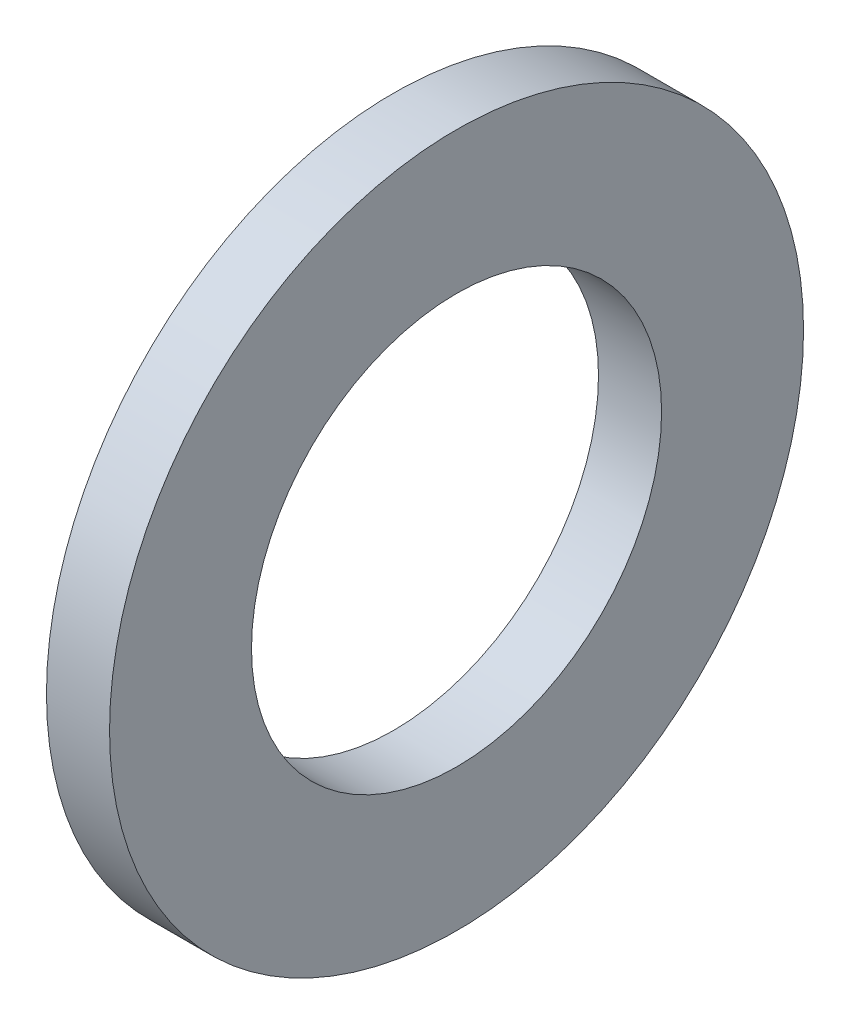
ISO-10303-21;
HEADER;
FILE_DESCRIPTION(('STEP AP214'),'2;1');
FILE_NAME('part.step','',(''),(''),'','','');
FILE_SCHEMA(('AUTOMOTIVE_DESIGN { 1 0 10303 214 1 1 1 1 }'));
ENDSEC;
DATA;
#1=APPLICATION_CONTEXT('core data for automotive mechanical design processes');
#2=APPLICATION_PROTOCOL_DEFINITION('international standard','automotive_design',2000,#1);
#3=PRODUCT_CONTEXT('',#1,'mechanical');
#4=PRODUCT('Part','Part','',(#3));
#5=PRODUCT_RELATED_PRODUCT_CATEGORY('part','',(#4));
#6=PRODUCT_DEFINITION_FORMATION('','',#4);
#7=PRODUCT_DEFINITION_CONTEXT('part definition',#1,'design');
#8=PRODUCT_DEFINITION('design','',#6,#7);
#9=PRODUCT_DEFINITION_SHAPE('','',#8);
#10=(LENGTH_UNIT() NAMED_UNIT(*) SI_UNIT(.MILLI.,.METRE.));
#11=(NAMED_UNIT(*) PLANE_ANGLE_UNIT() SI_UNIT($,.RADIAN.));
#12=(NAMED_UNIT(*) SI_UNIT($,.STERADIAN.) SOLID_ANGLE_UNIT());
#13=UNCERTAINTY_MEASURE_WITH_UNIT(LENGTH_MEASURE(1.E-05),#10,'distance_accuracy_value','');
#14=(GEOMETRIC_REPRESENTATION_CONTEXT(3) GLOBAL_UNCERTAINTY_ASSIGNED_CONTEXT((#13)) GLOBAL_UNIT_ASSIGNED_CONTEXT((#10,
#11,#12)) REPRESENTATION_CONTEXT('',''));
#15=CARTESIAN_POINT('',(0.,0.,0.));
#16=DIRECTION('',(0.,0.,1.));
#17=DIRECTION('',(1.,0.,0.));
#18=AXIS2_PLACEMENT_3D('',#15,#16,#17);
#19=CARTESIAN_POINT('',(-4.,22.,0.));
#20=DIRECTION('',(1.,0.,0.));
#21=DIRECTION('',(0.,0.,-1.));
#22=AXIS2_PLACEMENT_3D('',#19,#20,#21);
#23=PLANE('',#22);
#24=CARTESIAN_POINT('',(-4.,0.,0.));
#25=DIRECTION('',(-1.,0.,0.));
#26=DIRECTION('',(0.,0.,1.));
#27=AXIS2_PLACEMENT_3D('',#24,#25,#26);
#28=CIRCLE('',#27,22.);
#29=CARTESIAN_POINT('',(-4.,0.,22.));
#30=VERTEX_POINT('',#29);
#31=EDGE_CURVE('E18',#30,#30,#28,.F.);
#32=ORIENTED_EDGE('',*,*,#31,.F.);
#33=EDGE_LOOP('',(#32));
#34=FACE_BOUND('',#33,.T.);
#35=CARTESIAN_POINT('',(-4.,0.,0.));
#36=DIRECTION('',(-1.,0.,0.));
#37=DIRECTION('',(0.,0.,1.));
#38=AXIS2_PLACEMENT_3D('',#35,#36,#37);
#39=CIRCLE('',#38,13.);
#40=CARTESIAN_POINT('',(-4.,0.,13.));
#41=VERTEX_POINT('',#40);
#42=EDGE_CURVE('E27',#41,#41,#39,.F.);
#43=ORIENTED_EDGE('',*,*,#42,.T.);
#44=EDGE_LOOP('',(#43));
#45=FACE_BOUND('',#44,.T.);
#46=ADVANCED_FACE('F15',(#34,#45),#23,.F.);
#47=CARTESIAN_POINT('',(-34.9249999999999,0.,0.));
#48=DIRECTION('',(-1.,0.,0.));
#49=DIRECTION('',(0.,0.,1.));
#50=AXIS2_PLACEMENT_3D('',#47,#48,#49);
#51=CYLINDRICAL_SURFACE('',#50,22.);
#52=ORIENTED_EDGE('',*,*,#31,.T.);
#53=EDGE_LOOP('',(#52));
#54=FACE_BOUND('',#53,.T.);
#55=CARTESIAN_POINT('',(0.,0.,0.));
#56=DIRECTION('',(-1.,0.,0.));
#57=DIRECTION('',(0.,0.,1.));
#58=AXIS2_PLACEMENT_3D('',#55,#56,#57);
#59=CIRCLE('',#58,22.);
#60=CARTESIAN_POINT('',(0.,0.,22.));
#61=VERTEX_POINT('',#60);
#62=EDGE_CURVE('E22',#61,#61,#59,.T.);
#63=ORIENTED_EDGE('',*,*,#62,.T.);
#64=EDGE_LOOP('',(#63));
#65=FACE_BOUND('',#64,.T.);
#66=ADVANCED_FACE('F35',(#54,#65),#51,.T.);
#67=CARTESIAN_POINT('',(-34.9249999999999,0.,0.));
#68=DIRECTION('',(-1.,0.,0.));
#69=DIRECTION('',(0.,0.,1.));
#70=AXIS2_PLACEMENT_3D('',#67,#68,#69);
#71=CYLINDRICAL_SURFACE('',#70,13.);
#72=CARTESIAN_POINT('',(0.,0.,0.));
#73=DIRECTION('',(-1.,0.,0.));
#74=DIRECTION('',(0.,0.,1.));
#75=AXIS2_PLACEMENT_3D('',#72,#73,#74);
#76=CIRCLE('',#75,13.);
#77=CARTESIAN_POINT('',(0.,0.,13.));
#78=VERTEX_POINT('',#77);
#79=EDGE_CURVE('E10',#78,#78,#76,.F.);
#80=ORIENTED_EDGE('',*,*,#79,.T.);
#81=EDGE_LOOP('',(#80));
#82=FACE_BOUND('',#81,.T.);
#83=ORIENTED_EDGE('',*,*,#42,.F.);
#84=EDGE_LOOP('',(#83));
#85=FACE_BOUND('',#84,.T.);
#86=ADVANCED_FACE('F43',(#82,#85),#71,.F.);
#87=CARTESIAN_POINT('',(0.,13.,0.));
#88=DIRECTION('',(-1.,0.,0.));
#89=DIRECTION('',(0.,0.,1.));
#90=AXIS2_PLACEMENT_3D('',#87,#88,#89);
#91=PLANE('',#90);
#92=ORIENTED_EDGE('',*,*,#79,.F.);
#93=EDGE_LOOP('',(#92));
#94=FACE_BOUND('',#93,.T.);
#95=ORIENTED_EDGE('',*,*,#62,.F.);
#96=EDGE_LOOP('',(#95));
#97=FACE_BOUND('',#96,.T.);
#98=ADVANCED_FACE('F44',(#94,#97),#91,.F.);
#99=CLOSED_SHELL('',(#46,#66,#86,#98));
#100=MANIFOLD_SOLID_BREP('B1',#99);
#101=ADVANCED_BREP_SHAPE_REPRESENTATION('',(#18,#100),#14);
#102=SHAPE_DEFINITION_REPRESENTATION(#9,#101);
ENDSEC;
END-ISO-10303-21;
